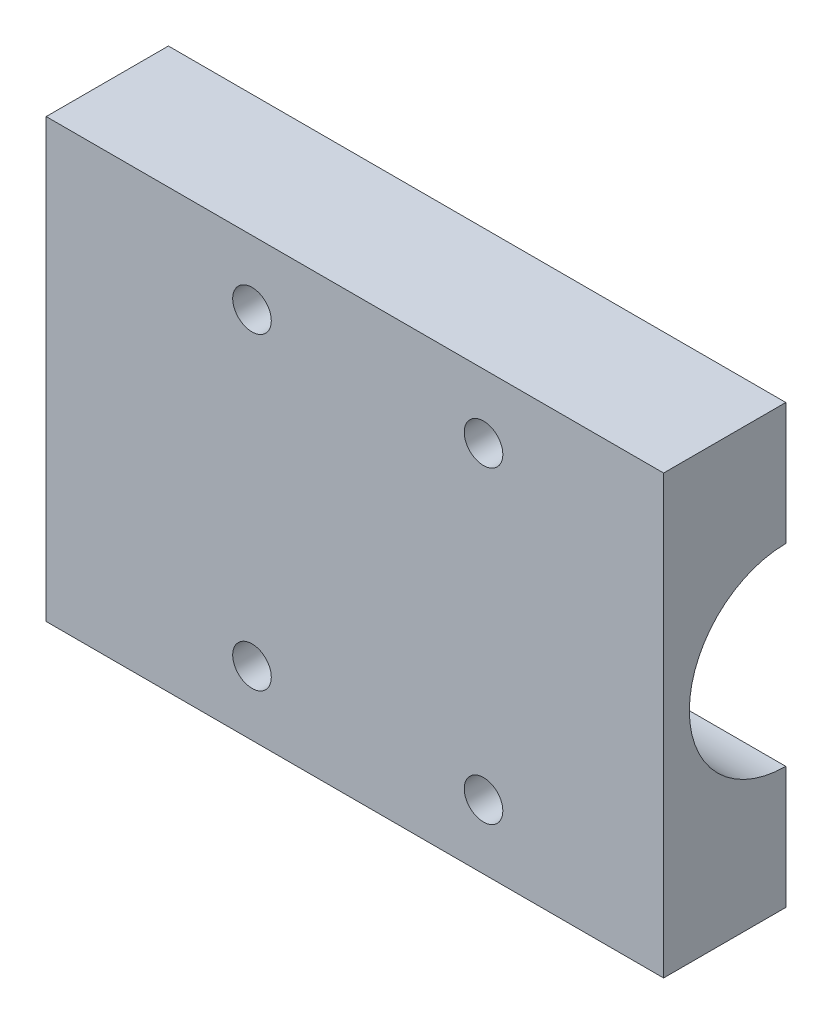
ISO-10303-21;
HEADER;
FILE_DESCRIPTION(('STEP AP214'),'2;1');
FILE_NAME('part.step','',(''),(''),'','','');
FILE_SCHEMA(('AUTOMOTIVE_DESIGN { 1 0 10303 214 1 1 1 1 }'));
ENDSEC;
DATA;
#1=APPLICATION_CONTEXT('core data for automotive mechanical design processes');
#2=APPLICATION_PROTOCOL_DEFINITION('international standard','automotive_design',2000,#1);
#3=PRODUCT_CONTEXT('',#1,'mechanical');
#4=PRODUCT('Part','Part','',(#3));
#5=PRODUCT_RELATED_PRODUCT_CATEGORY('part','',(#4));
#6=PRODUCT_DEFINITION_FORMATION('','',#4);
#7=PRODUCT_DEFINITION_CONTEXT('part definition',#1,'design');
#8=PRODUCT_DEFINITION('design','',#6,#7);
#9=PRODUCT_DEFINITION_SHAPE('','',#8);
#10=(LENGTH_UNIT() NAMED_UNIT(*) SI_UNIT(.MILLI.,.METRE.));
#11=(NAMED_UNIT(*) PLANE_ANGLE_UNIT() SI_UNIT($,.RADIAN.));
#12=(NAMED_UNIT(*) SI_UNIT($,.STERADIAN.) SOLID_ANGLE_UNIT());
#13=UNCERTAINTY_MEASURE_WITH_UNIT(LENGTH_MEASURE(1.E-05),#10,'distance_accuracy_value','');
#14=(GEOMETRIC_REPRESENTATION_CONTEXT(3) GLOBAL_UNCERTAINTY_ASSIGNED_CONTEXT((#13)) GLOBAL_UNIT_ASSIGNED_CONTEXT((#10,
#11,#12)) REPRESENTATION_CONTEXT('',''));
#15=CARTESIAN_POINT('',(0.,0.,0.));
#16=DIRECTION('',(0.,0.,1.));
#17=DIRECTION('',(1.,0.,0.));
#18=AXIS2_PLACEMENT_3D('',#15,#16,#17);
#19=CARTESIAN_POINT('',(0.,0.,0.));
#20=DIRECTION('',(0.,0.,1.));
#21=DIRECTION('',(1.,0.,0.));
#22=AXIS2_PLACEMENT_3D('',#19,#20,#21);
#23=PLANE('',#22);
#24=CARTESIAN_POINT('',(3.66480446927373,9.41340782122905,0.));
#25=DIRECTION('',(0.,0.,1.));
#26=DIRECTION('',(1.,0.,0.));
#27=AXIS2_PLACEMENT_3D('',#24,#25,#26);
#28=CIRCLE('',#27,1.5);
#29=CARTESIAN_POINT('',(5.16480446927373,9.41340782122905,0.));
#30=VERTEX_POINT('',#29);
#31=EDGE_CURVE('E167',#30,#30,#28,.T.);
#32=ORIENTED_EDGE('',*,*,#31,.T.);
#33=EDGE_LOOP('',(#32));
#34=FACE_BOUND('',#33,.T.);
#35=CARTESIAN_POINT('',(21.6648044692737,9.41340782122905,0.));
#36=DIRECTION('',(0.,0.,1.));
#37=DIRECTION('',(1.,0.,0.));
#38=AXIS2_PLACEMENT_3D('',#35,#36,#37);
#39=CIRCLE('',#38,1.5);
#40=CARTESIAN_POINT('',(23.1648044692737,9.41340782122905,0.));
#41=VERTEX_POINT('',#40);
#42=EDGE_CURVE('E164',#41,#41,#39,.T.);
#43=ORIENTED_EDGE('',*,*,#42,.T.);
#44=EDGE_LOOP('',(#43));
#45=FACE_BOUND('',#44,.T.);
#46=DIRECTION('',(0.,-1.,0.));
#47=VECTOR('',#46,1.);
#48=CARTESIAN_POINT('',(35.6648044692737,0.,0.));
#49=LINE('',#48,#47);
#50=CARTESIAN_POINT('',(35.6648044692737,14.4134078212291,0.));
#51=VERTEX_POINT('',#50);
#52=CARTESIAN_POINT('',(35.6648044692737,4.91340782122906,0.));
#53=VERTEX_POINT('',#52);
#54=EDGE_CURVE('E114',#51,#53,#49,.T.);
#55=ORIENTED_EDGE('',*,*,#54,.T.);
#56=DIRECTION('',(-1.,0.,0.));
#57=VECTOR('',#56,1.);
#58=CARTESIAN_POINT('',(37.1648044692738,4.91340782122906,0.));
#59=LINE('',#58,#57);
#60=CARTESIAN_POINT('',(-12.3351955307263,4.91340782122905,0.));
#61=VERTEX_POINT('',#60);
#62=EDGE_CURVE('E11',#53,#61,#59,.T.);
#63=ORIENTED_EDGE('',*,*,#62,.T.);
#64=DIRECTION('',(0.,-1.,0.));
#65=VECTOR('',#64,1.);
#66=CARTESIAN_POINT('',(-12.3351955307263,0.,0.));
#67=LINE('',#66,#65);
#68=CARTESIAN_POINT('',(-12.3351955307263,14.4134078212291,0.));
#69=VERTEX_POINT('',#68);
#70=EDGE_CURVE('E105',#69,#61,#67,.T.);
#71=ORIENTED_EDGE('',*,*,#70,.F.);
#72=DIRECTION('',(1.,0.,0.));
#73=VECTOR('',#72,1.);
#74=CARTESIAN_POINT('',(0.,14.4134078212291,0.));
#75=LINE('',#74,#73);
#76=EDGE_CURVE('E111',#69,#51,#75,.T.);
#77=ORIENTED_EDGE('',*,*,#76,.T.);
#78=EDGE_LOOP('',(#55,#63,#71,#77));
#79=FACE_BOUND('',#78,.T.);
#80=ADVANCED_FACE('F35',(#34,#45,#79),#23,.F.);
#81=CARTESIAN_POINT('',(35.6648044692737,0.,9.5));
#82=DIRECTION('',(1.,0.,0.));
#83=DIRECTION('',(0.,1.,0.));
#84=AXIS2_PLACEMENT_3D('',#81,#82,#83);
#85=PLANE('',#84);
#86=CARTESIAN_POINT('',(35.6648044692737,-2.58659217877094,0.));
#87=DIRECTION('',(1.,0.,0.));
#88=DIRECTION('',(0.,1.,0.));
#89=AXIS2_PLACEMENT_3D('',#86,#87,#88);
#90=CIRCLE('',#89,7.5);
#91=CARTESIAN_POINT('',(35.6648044692737,-10.0865921787709,0.));
#92=VERTEX_POINT('',#91);
#93=EDGE_CURVE('E50',#53,#92,#90,.T.);
#94=ORIENTED_EDGE('',*,*,#93,.F.);
#95=ORIENTED_EDGE('',*,*,#54,.F.);
#96=DIRECTION('',(0.,0.,-1.));
#97=VECTOR('',#96,1.);
#98=CARTESIAN_POINT('',(35.6648044692737,14.4134078212291,9.5));
#99=LINE('',#98,#97);
#100=CARTESIAN_POINT('',(35.6648044692737,14.4134078212291,9.5));
#101=VERTEX_POINT('',#100);
#102=EDGE_CURVE('E87',#101,#51,#99,.T.);
#103=ORIENTED_EDGE('',*,*,#102,.F.);
#104=DIRECTION('',(0.,-1.,0.));
#105=VECTOR('',#104,1.);
#106=CARTESIAN_POINT('',(35.6648044692737,0.,9.5));
#107=LINE('',#106,#105);
#108=CARTESIAN_POINT('',(35.6648044692737,-19.5865921787709,9.5));
#109=VERTEX_POINT('',#108);
#110=EDGE_CURVE('E209',#101,#109,#107,.T.);
#111=ORIENTED_EDGE('',*,*,#110,.T.);
#112=DIRECTION('',(0.,0.,-1.));
#113=VECTOR('',#112,1.);
#114=CARTESIAN_POINT('',(35.6648044692737,-19.5865921787709,9.5));
#115=LINE('',#114,#113);
#116=CARTESIAN_POINT('',(35.6648044692737,-19.5865921787709,0.));
#117=VERTEX_POINT('',#116);
#118=EDGE_CURVE('E120',#109,#117,#115,.T.);
#119=ORIENTED_EDGE('',*,*,#118,.T.);
#120=EDGE_CURVE('E80',#92,#117,#49,.T.);
#121=ORIENTED_EDGE('',*,*,#120,.F.);
#122=EDGE_LOOP('',(#94,#95,#103,#111,#119,#121));
#123=FACE_BOUND('',#122,.T.);
#124=ADVANCED_FACE('F133',(#123),#85,.T.);
#125=CARTESIAN_POINT('',(0.,14.4134078212291,9.5));
#126=DIRECTION('',(0.,1.,0.));
#127=DIRECTION('',(0.,0.,1.));
#128=AXIS2_PLACEMENT_3D('',#125,#126,#127);
#129=PLANE('',#128);
#130=ORIENTED_EDGE('',*,*,#76,.F.);
#131=DIRECTION('',(0.,0.,-1.));
#132=VECTOR('',#131,1.);
#133=CARTESIAN_POINT('',(-12.3351955307263,14.4134078212291,9.5));
#134=LINE('',#133,#132);
#135=CARTESIAN_POINT('',(-12.3351955307263,14.4134078212291,9.5));
#136=VERTEX_POINT('',#135);
#137=EDGE_CURVE('E124',#136,#69,#134,.T.);
#138=ORIENTED_EDGE('',*,*,#137,.F.);
#139=DIRECTION('',(1.,0.,0.));
#140=VECTOR('',#139,1.);
#141=CARTESIAN_POINT('',(0.,14.4134078212291,9.5));
#142=LINE('',#141,#140);
#143=EDGE_CURVE('E131',#136,#101,#142,.T.);
#144=ORIENTED_EDGE('',*,*,#143,.T.);
#145=ORIENTED_EDGE('',*,*,#102,.T.);
#146=EDGE_LOOP('',(#130,#138,#144,#145));
#147=FACE_BOUND('',#146,.T.);
#148=ADVANCED_FACE('F129',(#147),#129,.T.);
#149=CARTESIAN_POINT('',(-12.3351955307263,0.,9.5));
#150=DIRECTION('',(1.,0.,0.));
#151=DIRECTION('',(0.,1.,0.));
#152=AXIS2_PLACEMENT_3D('',#149,#150,#151);
#153=PLANE('',#152);
#154=ORIENTED_EDGE('',*,*,#70,.T.);
#155=CARTESIAN_POINT('',(-12.3351955307263,-2.58659217877095,0.));
#156=DIRECTION('',(-1.,0.,0.));
#157=DIRECTION('',(0.,-1.,0.));
#158=AXIS2_PLACEMENT_3D('',#155,#156,#157);
#159=CIRCLE('',#158,7.5);
#160=CARTESIAN_POINT('',(-12.3351955307263,-10.0865921787709,0.));
#161=VERTEX_POINT('',#160);
#162=EDGE_CURVE('E97',#161,#61,#159,.T.);
#163=ORIENTED_EDGE('',*,*,#162,.F.);
#164=CARTESIAN_POINT('',(-12.3351955307263,-19.5865921787709,0.));
#165=VERTEX_POINT('',#164);
#166=EDGE_CURVE('E103',#161,#165,#67,.T.);
#167=ORIENTED_EDGE('',*,*,#166,.T.);
#168=DIRECTION('',(0.,0.,-1.));
#169=VECTOR('',#168,1.);
#170=CARTESIAN_POINT('',(-12.3351955307263,-19.5865921787709,9.5));
#171=LINE('',#170,#169);
#172=CARTESIAN_POINT('',(-12.3351955307263,-19.5865921787709,9.5));
#173=VERTEX_POINT('',#172);
#174=EDGE_CURVE('E122',#173,#165,#171,.T.);
#175=ORIENTED_EDGE('',*,*,#174,.F.);
#176=DIRECTION('',(0.,-1.,0.));
#177=VECTOR('',#176,1.);
#178=CARTESIAN_POINT('',(-12.3351955307263,0.,9.5));
#179=LINE('',#178,#177);
#180=EDGE_CURVE('E212',#136,#173,#179,.T.);
#181=ORIENTED_EDGE('',*,*,#180,.F.);
#182=ORIENTED_EDGE('',*,*,#137,.T.);
#183=EDGE_LOOP('',(#154,#163,#167,#175,#181,#182));
#184=FACE_BOUND('',#183,.T.);
#185=ADVANCED_FACE('F101',(#184),#153,.F.);
#186=CARTESIAN_POINT('',(3.66480446927373,9.41340782122905,9.5));
#187=DIRECTION('',(0.,0.,-1.));
#188=DIRECTION('',(-1.,0.,0.));
#189=AXIS2_PLACEMENT_3D('',#186,#187,#188);
#190=CYLINDRICAL_SURFACE('',#189,1.5);
#191=CARTESIAN_POINT('',(3.66480446927373,9.41340782122905,9.5));
#192=DIRECTION('',(0.,0.,1.));
#193=DIRECTION('',(1.,0.,0.));
#194=AXIS2_PLACEMENT_3D('',#191,#192,#193);
#195=CIRCLE('',#194,1.5);
#196=CARTESIAN_POINT('',(5.16480446927373,9.41340782122905,9.5));
#197=VERTEX_POINT('',#196);
#198=EDGE_CURVE('E202',#197,#197,#195,.T.);
#199=ORIENTED_EDGE('',*,*,#198,.T.);
#200=EDGE_LOOP('',(#199));
#201=FACE_BOUND('',#200,.T.);
#202=ORIENTED_EDGE('',*,*,#31,.F.);
#203=EDGE_LOOP('',(#202));
#204=FACE_BOUND('',#203,.T.);
#205=ADVANCED_FACE('F174',(#201,#204),#190,.F.);
#206=CARTESIAN_POINT('',(21.6648044692737,9.41340782122905,9.5));
#207=DIRECTION('',(0.,0.,-1.));
#208=DIRECTION('',(-1.,0.,0.));
#209=AXIS2_PLACEMENT_3D('',#206,#207,#208);
#210=CYLINDRICAL_SURFACE('',#209,1.5);
#211=CARTESIAN_POINT('',(21.6648044692737,9.41340782122905,9.5));
#212=DIRECTION('',(0.,0.,1.));
#213=DIRECTION('',(1.,0.,0.));
#214=AXIS2_PLACEMENT_3D('',#211,#212,#213);
#215=CIRCLE('',#214,1.5);
#216=CARTESIAN_POINT('',(23.1648044692737,9.41340782122905,9.5));
#217=VERTEX_POINT('',#216);
#218=EDGE_CURVE('E199',#217,#217,#215,.T.);
#219=ORIENTED_EDGE('',*,*,#218,.T.);
#220=EDGE_LOOP('',(#219));
#221=FACE_BOUND('',#220,.T.);
#222=ORIENTED_EDGE('',*,*,#42,.F.);
#223=EDGE_LOOP('',(#222));
#224=FACE_BOUND('',#223,.T.);
#225=ADVANCED_FACE('F176',(#221,#224),#210,.F.);
#226=CARTESIAN_POINT('',(3.66480446927374,-14.5865921787709,9.5));
#227=DIRECTION('',(0.,0.,-1.));
#228=DIRECTION('',(-1.,0.,0.));
#229=AXIS2_PLACEMENT_3D('',#226,#227,#228);
#230=CYLINDRICAL_SURFACE('',#229,1.5);
#231=CARTESIAN_POINT('',(3.66480446927374,-14.5865921787709,9.5));
#232=DIRECTION('',(0.,0.,1.));
#233=DIRECTION('',(1.,0.,0.));
#234=AXIS2_PLACEMENT_3D('',#231,#232,#233);
#235=CIRCLE('',#234,1.5);
#236=CARTESIAN_POINT('',(5.16480446927374,-14.5865921787709,9.5));
#237=VERTEX_POINT('',#236);
#238=EDGE_CURVE('E197',#237,#237,#235,.T.);
#239=ORIENTED_EDGE('',*,*,#238,.T.);
#240=EDGE_LOOP('',(#239));
#241=FACE_BOUND('',#240,.T.);
#242=CARTESIAN_POINT('',(3.66480446927374,-14.5865921787709,0.));
#243=DIRECTION('',(0.,0.,1.));
#244=DIRECTION('',(1.,0.,0.));
#245=AXIS2_PLACEMENT_3D('',#242,#243,#244);
#246=CIRCLE('',#245,1.5);
#247=CARTESIAN_POINT('',(5.16480446927374,-14.5865921787709,0.));
#248=VERTEX_POINT('',#247);
#249=EDGE_CURVE('E162',#248,#248,#246,.T.);
#250=ORIENTED_EDGE('',*,*,#249,.F.);
#251=EDGE_LOOP('',(#250));
#252=FACE_BOUND('',#251,.T.);
#253=ADVANCED_FACE('F183',(#241,#252),#230,.F.);
#254=CARTESIAN_POINT('',(21.6648044692737,-14.5865921787709,9.5));
#255=DIRECTION('',(0.,0.,-1.));
#256=DIRECTION('',(-1.,0.,0.));
#257=AXIS2_PLACEMENT_3D('',#254,#255,#256);
#258=CYLINDRICAL_SURFACE('',#257,1.5);
#259=CARTESIAN_POINT('',(21.6648044692737,-14.5865921787709,9.5));
#260=DIRECTION('',(0.,0.,1.));
#261=DIRECTION('',(1.,0.,0.));
#262=AXIS2_PLACEMENT_3D('',#259,#260,#261);
#263=CIRCLE('',#262,1.5);
#264=CARTESIAN_POINT('',(23.1648044692737,-14.5865921787709,9.5));
#265=VERTEX_POINT('',#264);
#266=EDGE_CURVE('E119',#265,#265,#263,.T.);
#267=ORIENTED_EDGE('',*,*,#266,.T.);
#268=EDGE_LOOP('',(#267));
#269=FACE_BOUND('',#268,.T.);
#270=CARTESIAN_POINT('',(21.6648044692737,-14.5865921787709,0.));
#271=DIRECTION('',(0.,0.,1.));
#272=DIRECTION('',(1.,0.,0.));
#273=AXIS2_PLACEMENT_3D('',#270,#271,#272);
#274=CIRCLE('',#273,1.5);
#275=CARTESIAN_POINT('',(23.1648044692737,-14.5865921787709,0.));
#276=VERTEX_POINT('',#275);
#277=EDGE_CURVE('E159',#276,#276,#274,.T.);
#278=ORIENTED_EDGE('',*,*,#277,.F.);
#279=EDGE_LOOP('',(#278));
#280=FACE_BOUND('',#279,.T.);
#281=ADVANCED_FACE('F37',(#269,#280),#258,.F.);
#282=CARTESIAN_POINT('',(0.,-19.5865921787709,9.5));
#283=DIRECTION('',(0.,1.,0.));
#284=DIRECTION('',(0.,0.,1.));
#285=AXIS2_PLACEMENT_3D('',#282,#283,#284);
#286=PLANE('',#285);
#287=DIRECTION('',(1.,0.,0.));
#288=VECTOR('',#287,1.);
#289=CARTESIAN_POINT('',(0.,-19.5865921787709,0.));
#290=LINE('',#289,#288);
#291=EDGE_CURVE('E109',#165,#117,#290,.T.);
#292=ORIENTED_EDGE('',*,*,#291,.T.);
#293=ORIENTED_EDGE('',*,*,#118,.F.);
#294=DIRECTION('',(1.,0.,0.));
#295=VECTOR('',#294,1.);
#296=CARTESIAN_POINT('',(0.,-19.5865921787709,9.5));
#297=LINE('',#296,#295);
#298=EDGE_CURVE('E59',#173,#109,#297,.T.);
#299=ORIENTED_EDGE('',*,*,#298,.F.);
#300=ORIENTED_EDGE('',*,*,#174,.T.);
#301=EDGE_LOOP('',(#292,#293,#299,#300));
#302=FACE_BOUND('',#301,.T.);
#303=ADVANCED_FACE('F154',(#302),#286,.F.);
#304=CARTESIAN_POINT('',(0.,0.,9.5));
#305=DIRECTION('',(0.,0.,1.));
#306=DIRECTION('',(1.,0.,0.));
#307=AXIS2_PLACEMENT_3D('',#304,#305,#306);
#308=PLANE('',#307);
#309=ORIENTED_EDGE('',*,*,#266,.F.);
#310=EDGE_LOOP('',(#309));
#311=FACE_BOUND('',#310,.T.);
#312=ORIENTED_EDGE('',*,*,#238,.F.);
#313=EDGE_LOOP('',(#312));
#314=FACE_BOUND('',#313,.T.);
#315=ORIENTED_EDGE('',*,*,#218,.F.);
#316=EDGE_LOOP('',(#315));
#317=FACE_BOUND('',#316,.T.);
#318=ORIENTED_EDGE('',*,*,#198,.F.);
#319=EDGE_LOOP('',(#318));
#320=FACE_BOUND('',#319,.T.);
#321=ORIENTED_EDGE('',*,*,#110,.F.);
#322=ORIENTED_EDGE('',*,*,#143,.F.);
#323=ORIENTED_EDGE('',*,*,#180,.T.);
#324=ORIENTED_EDGE('',*,*,#298,.T.);
#325=EDGE_LOOP('',(#321,#322,#323,#324));
#326=FACE_BOUND('',#325,.T.);
#327=ADVANCED_FACE('F147',(#311,#314,#317,#320,#326),#308,.T.);
#328=ORIENTED_EDGE('',*,*,#277,.T.);
#329=EDGE_LOOP('',(#328));
#330=FACE_BOUND('',#329,.T.);
#331=ORIENTED_EDGE('',*,*,#249,.T.);
#332=EDGE_LOOP('',(#331));
#333=FACE_BOUND('',#332,.T.);
#334=ORIENTED_EDGE('',*,*,#166,.F.);
#335=DIRECTION('',(-1.,0.,0.));
#336=VECTOR('',#335,1.);
#337=CARTESIAN_POINT('',(37.1648044692738,-10.0865921787709,0.));
#338=LINE('',#337,#336);
#339=EDGE_CURVE('E43',#161,#92,#338,.F.);
#340=ORIENTED_EDGE('',*,*,#339,.T.);
#341=ORIENTED_EDGE('',*,*,#120,.T.);
#342=ORIENTED_EDGE('',*,*,#291,.F.);
#343=EDGE_LOOP('',(#334,#340,#341,#342));
#344=FACE_BOUND('',#343,.T.);
#345=ADVANCED_FACE('F107',(#330,#333,#344),#23,.F.);
#346=CARTESIAN_POINT('',(37.1648044692738,-2.58659217877094,0.));
#347=DIRECTION('',(-1.,0.,0.));
#348=DIRECTION('',(0.,-1.,0.));
#349=AXIS2_PLACEMENT_3D('',#346,#347,#348);
#350=CYLINDRICAL_SURFACE('',#349,7.5);
#351=ORIENTED_EDGE('',*,*,#93,.T.);
#352=ORIENTED_EDGE('',*,*,#339,.F.);
#353=ORIENTED_EDGE('',*,*,#162,.T.);
#354=ORIENTED_EDGE('',*,*,#62,.F.);
#355=EDGE_LOOP('',(#351,#352,#353,#354));
#356=FACE_BOUND('',#355,.T.);
#357=ADVANCED_FACE('F96',(#356),#350,.F.);
#358=CLOSED_SHELL('',(#80,#124,#148,#185,#205,#225,#253,#281,#303,#327,#345,#357));
#359=MANIFOLD_SOLID_BREP('B2',#358);
#360=ADVANCED_BREP_SHAPE_REPRESENTATION('',(#18,#359),#14);
#361=SHAPE_DEFINITION_REPRESENTATION(#9,#360);
ENDSEC;
END-ISO-10303-21;
